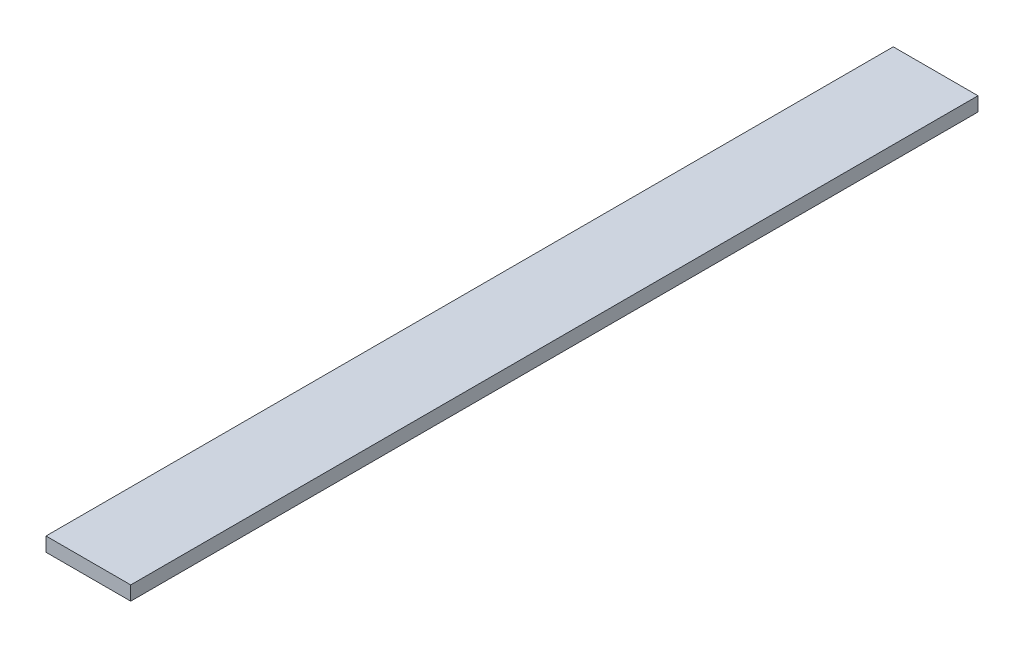
ISO-10303-21;
HEADER;
FILE_DESCRIPTION(('STEP AP214'),'2;1');
FILE_NAME('part.step','',(''),(''),'','','');
FILE_SCHEMA(('AUTOMOTIVE_DESIGN { 1 0 10303 214 1 1 1 1 }'));
ENDSEC;
DATA;
#1=APPLICATION_CONTEXT('core data for automotive mechanical design processes');
#2=APPLICATION_PROTOCOL_DEFINITION('international standard','automotive_design',2000,#1);
#3=PRODUCT_CONTEXT('',#1,'mechanical');
#4=PRODUCT('Part','Part','',(#3));
#5=PRODUCT_RELATED_PRODUCT_CATEGORY('part','',(#4));
#6=PRODUCT_DEFINITION_FORMATION('','',#4);
#7=PRODUCT_DEFINITION_CONTEXT('part definition',#1,'design');
#8=PRODUCT_DEFINITION('design','',#6,#7);
#9=PRODUCT_DEFINITION_SHAPE('','',#8);
#10=(LENGTH_UNIT() NAMED_UNIT(*) SI_UNIT(.MILLI.,.METRE.));
#11=(NAMED_UNIT(*) PLANE_ANGLE_UNIT() SI_UNIT($,.RADIAN.));
#12=(NAMED_UNIT(*) SI_UNIT($,.STERADIAN.) SOLID_ANGLE_UNIT());
#13=UNCERTAINTY_MEASURE_WITH_UNIT(LENGTH_MEASURE(1.E-05),#10,'distance_accuracy_value','');
#14=(GEOMETRIC_REPRESENTATION_CONTEXT(3) GLOBAL_UNCERTAINTY_ASSIGNED_CONTEXT((#13)) GLOBAL_UNIT_ASSIGNED_CONTEXT((#10,
#11,#12)) REPRESENTATION_CONTEXT('',''));
#15=CARTESIAN_POINT('',(0.,0.,0.));
#16=DIRECTION('',(0.,0.,1.));
#17=DIRECTION('',(1.,0.,0.));
#18=AXIS2_PLACEMENT_3D('',#15,#16,#17);
#19=CARTESIAN_POINT('',(-15.,5.,-150.));
#20=DIRECTION('',(1.,0.,0.));
#21=DIRECTION('',(0.,0.,-1.));
#22=AXIS2_PLACEMENT_3D('',#19,#20,#21);
#23=PLANE('',#22);
#24=DIRECTION('',(0.,0.,1.));
#25=VECTOR('',#24,1.);
#26=CARTESIAN_POINT('',(-15.,0.,-150.));
#27=LINE('',#26,#25);
#28=CARTESIAN_POINT('',(-15.,0.,-150.));
#29=VERTEX_POINT('',#28);
#30=CARTESIAN_POINT('',(-15.,0.,150.));
#31=VERTEX_POINT('',#30);
#32=EDGE_CURVE('E100',#29,#31,#27,.T.);
#33=ORIENTED_EDGE('',*,*,#32,.T.);
#34=DIRECTION('',(0.,-1.,0.));
#35=VECTOR('',#34,1.);
#36=CARTESIAN_POINT('',(-15.,5.,150.));
#37=LINE('',#36,#35);
#38=CARTESIAN_POINT('',(-15.,5.,150.));
#39=VERTEX_POINT('',#38);
#40=EDGE_CURVE('E11',#39,#31,#37,.T.);
#41=ORIENTED_EDGE('',*,*,#40,.F.);
#42=DIRECTION('',(0.,0.,1.));
#43=VECTOR('',#42,1.);
#44=CARTESIAN_POINT('',(-15.,5.,-150.));
#45=LINE('',#44,#43);
#46=CARTESIAN_POINT('',(-15.,5.,-150.));
#47=VERTEX_POINT('',#46);
#48=EDGE_CURVE('E88',#47,#39,#45,.T.);
#49=ORIENTED_EDGE('',*,*,#48,.F.);
#50=DIRECTION('',(0.,-1.,0.));
#51=VECTOR('',#50,1.);
#52=CARTESIAN_POINT('',(-15.,5.,-150.));
#53=LINE('',#52,#51);
#54=EDGE_CURVE('E96',#47,#29,#53,.T.);
#55=ORIENTED_EDGE('',*,*,#54,.T.);
#56=EDGE_LOOP('',(#33,#41,#49,#55));
#57=FACE_BOUND('',#56,.T.);
#58=ADVANCED_FACE('F37',(#57),#23,.F.);
#59=CARTESIAN_POINT('',(15.,5.,150.));
#60=DIRECTION('',(0.,0.,-1.));
#61=DIRECTION('',(-1.,0.,0.));
#62=AXIS2_PLACEMENT_3D('',#59,#60,#61);
#63=PLANE('',#62);
#64=DIRECTION('',(1.,0.,0.));
#65=VECTOR('',#64,1.);
#66=CARTESIAN_POINT('',(15.,0.,150.));
#67=LINE('',#66,#65);
#68=CARTESIAN_POINT('',(15.,0.,150.));
#69=VERTEX_POINT('',#68);
#70=EDGE_CURVE('E92',#31,#69,#67,.T.);
#71=ORIENTED_EDGE('',*,*,#70,.T.);
#72=DIRECTION('',(0.,-1.,0.));
#73=VECTOR('',#72,1.);
#74=CARTESIAN_POINT('',(15.,5.,150.));
#75=LINE('',#74,#73);
#76=CARTESIAN_POINT('',(15.,5.,150.));
#77=VERTEX_POINT('',#76);
#78=EDGE_CURVE('E45',#77,#69,#75,.T.);
#79=ORIENTED_EDGE('',*,*,#78,.F.);
#80=DIRECTION('',(1.,0.,0.));
#81=VECTOR('',#80,1.);
#82=CARTESIAN_POINT('',(15.,5.,150.));
#83=LINE('',#82,#81);
#84=EDGE_CURVE('E83',#39,#77,#83,.T.);
#85=ORIENTED_EDGE('',*,*,#84,.F.);
#86=ORIENTED_EDGE('',*,*,#40,.T.);
#87=EDGE_LOOP('',(#71,#79,#85,#86));
#88=FACE_BOUND('',#87,.T.);
#89=ADVANCED_FACE('F91',(#88),#63,.F.);
#90=CARTESIAN_POINT('',(15.,5.,-150.));
#91=DIRECTION('',(-1.,0.,0.));
#92=DIRECTION('',(0.,0.,1.));
#93=AXIS2_PLACEMENT_3D('',#90,#91,#92);
#94=PLANE('',#93);
#95=DIRECTION('',(0.,0.,-1.));
#96=VECTOR('',#95,1.);
#97=CARTESIAN_POINT('',(15.,0.,-150.));
#98=LINE('',#97,#96);
#99=CARTESIAN_POINT('',(15.,0.,-150.));
#100=VERTEX_POINT('',#99);
#101=EDGE_CURVE('E70',#69,#100,#98,.T.);
#102=ORIENTED_EDGE('',*,*,#101,.T.);
#103=DIRECTION('',(0.,-1.,0.));
#104=VECTOR('',#103,1.);
#105=CARTESIAN_POINT('',(15.,5.,-150.));
#106=LINE('',#105,#104);
#107=CARTESIAN_POINT('',(15.,5.,-150.));
#108=VERTEX_POINT('',#107);
#109=EDGE_CURVE('E93',#108,#100,#106,.T.);
#110=ORIENTED_EDGE('',*,*,#109,.F.);
#111=DIRECTION('',(0.,0.,-1.));
#112=VECTOR('',#111,1.);
#113=CARTESIAN_POINT('',(15.,5.,-150.));
#114=LINE('',#113,#112);
#115=EDGE_CURVE('E86',#77,#108,#114,.T.);
#116=ORIENTED_EDGE('',*,*,#115,.F.);
#117=ORIENTED_EDGE('',*,*,#78,.T.);
#118=EDGE_LOOP('',(#102,#110,#116,#117));
#119=FACE_BOUND('',#118,.T.);
#120=ADVANCED_FACE('F94',(#119),#94,.F.);
#121=CARTESIAN_POINT('',(15.,5.,-150.));
#122=DIRECTION('',(0.,0.,1.));
#123=DIRECTION('',(1.,0.,0.));
#124=AXIS2_PLACEMENT_3D('',#121,#122,#123);
#125=PLANE('',#124);
#126=DIRECTION('',(-1.,0.,0.));
#127=VECTOR('',#126,1.);
#128=CARTESIAN_POINT('',(15.,0.,-150.));
#129=LINE('',#128,#127);
#130=EDGE_CURVE('E76',#100,#29,#129,.T.);
#131=ORIENTED_EDGE('',*,*,#130,.T.);
#132=ORIENTED_EDGE('',*,*,#54,.F.);
#133=DIRECTION('',(-1.,0.,0.));
#134=VECTOR('',#133,1.);
#135=CARTESIAN_POINT('',(15.,5.,-150.));
#136=LINE('',#135,#134);
#137=EDGE_CURVE('E53',#108,#47,#136,.T.);
#138=ORIENTED_EDGE('',*,*,#137,.F.);
#139=ORIENTED_EDGE('',*,*,#109,.T.);
#140=EDGE_LOOP('',(#131,#132,#138,#139));
#141=FACE_BOUND('',#140,.T.);
#142=ADVANCED_FACE('F107',(#141),#125,.F.);
#143=CARTESIAN_POINT('',(0.,5.,0.));
#144=DIRECTION('',(0.,-1.,0.));
#145=DIRECTION('',(0.,0.,-1.));
#146=AXIS2_PLACEMENT_3D('',#143,#144,#145);
#147=PLANE('',#146);
#148=ORIENTED_EDGE('',*,*,#48,.T.);
#149=ORIENTED_EDGE('',*,*,#84,.T.);
#150=ORIENTED_EDGE('',*,*,#115,.T.);
#151=ORIENTED_EDGE('',*,*,#137,.T.);
#152=EDGE_LOOP('',(#148,#149,#150,#151));
#153=FACE_BOUND('',#152,.T.);
#154=ADVANCED_FACE('F84',(#153),#147,.F.);
#155=CARTESIAN_POINT('',(0.,0.,0.));
#156=DIRECTION('',(0.,-1.,0.));
#157=DIRECTION('',(0.,0.,-1.));
#158=AXIS2_PLACEMENT_3D('',#155,#156,#157);
#159=PLANE('',#158);
#160=ORIENTED_EDGE('',*,*,#32,.F.);
#161=ORIENTED_EDGE('',*,*,#130,.F.);
#162=ORIENTED_EDGE('',*,*,#101,.F.);
#163=ORIENTED_EDGE('',*,*,#70,.F.);
#164=EDGE_LOOP('',(#160,#161,#162,#163));
#165=FACE_BOUND('',#164,.T.);
#166=ADVANCED_FACE('F110',(#165),#159,.T.);
#167=CLOSED_SHELL('',(#58,#89,#120,#142,#154,#166));
#168=MANIFOLD_SOLID_BREP('B2',#167);
#169=ADVANCED_BREP_SHAPE_REPRESENTATION('',(#18,#168),#14);
#170=SHAPE_DEFINITION_REPRESENTATION(#9,#169);
ENDSEC;
END-ISO-10303-21;
